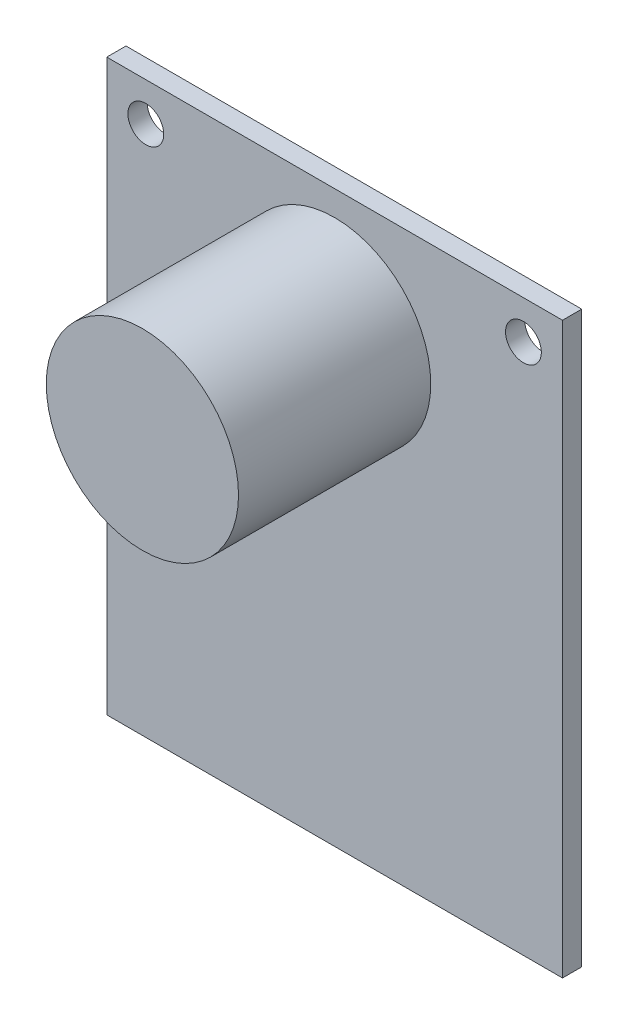
ISO-10303-21;
HEADER;
FILE_DESCRIPTION(('STEP AP214'),'2;1');
FILE_NAME('part.step','',(''),(''),'','','');
FILE_SCHEMA(('AUTOMOTIVE_DESIGN { 1 0 10303 214 1 1 1 1 }'));
ENDSEC;
DATA;
#1=APPLICATION_CONTEXT('core data for automotive mechanical design processes');
#2=APPLICATION_PROTOCOL_DEFINITION('international standard','automotive_design',2000,#1);
#3=PRODUCT_CONTEXT('',#1,'mechanical');
#4=PRODUCT('Part','Part','',(#3));
#5=PRODUCT_RELATED_PRODUCT_CATEGORY('part','',(#4));
#6=PRODUCT_DEFINITION_FORMATION('','',#4);
#7=PRODUCT_DEFINITION_CONTEXT('part definition',#1,'design');
#8=PRODUCT_DEFINITION('design','',#6,#7);
#9=PRODUCT_DEFINITION_SHAPE('','',#8);
#10=(LENGTH_UNIT() NAMED_UNIT(*) SI_UNIT(.MILLI.,.METRE.));
#11=(NAMED_UNIT(*) PLANE_ANGLE_UNIT() SI_UNIT($,.RADIAN.));
#12=(NAMED_UNIT(*) SI_UNIT($,.STERADIAN.) SOLID_ANGLE_UNIT());
#13=UNCERTAINTY_MEASURE_WITH_UNIT(LENGTH_MEASURE(1.E-05),#10,'distance_accuracy_value','');
#14=(GEOMETRIC_REPRESENTATION_CONTEXT(3) GLOBAL_UNCERTAINTY_ASSIGNED_CONTEXT((#13)) GLOBAL_UNIT_ASSIGNED_CONTEXT((#10,
#11,#12)) REPRESENTATION_CONTEXT('',''));
#15=CARTESIAN_POINT('',(0.,0.,0.));
#16=DIRECTION('',(0.,0.,1.));
#17=DIRECTION('',(1.,0.,0.));
#18=AXIS2_PLACEMENT_3D('',#15,#16,#17);
#19=CARTESIAN_POINT('',(0.,0.,1.5));
#20=DIRECTION('',(0.,0.,1.));
#21=DIRECTION('',(1.,0.,0.));
#22=AXIS2_PLACEMENT_3D('',#19,#20,#21);
#23=PLANE('',#22);
#24=CARTESIAN_POINT('',(0.,35.,1.5));
#25=DIRECTION('',(0.,0.,1.));
#26=DIRECTION('',(1.,0.,0.));
#27=AXIS2_PLACEMENT_3D('',#24,#25,#26);
#28=CIRCLE('',#27,7.5);
#29=CARTESIAN_POINT('',(7.5,35.,1.5));
#30=VERTEX_POINT('',#29);
#31=EDGE_CURVE('E128',#30,#30,#28,.T.);
#32=ORIENTED_EDGE('',*,*,#31,.F.);
#33=EDGE_LOOP('',(#32));
#34=FACE_BOUND('',#33,.T.);
#35=CARTESIAN_POINT('',(-14.732,41.45,1.5));
#36=DIRECTION('',(0.,0.,1.));
#37=DIRECTION('',(1.,0.,0.));
#38=AXIS2_PLACEMENT_3D('',#35,#36,#37);
#39=CIRCLE('',#38,1.397);
#40=CARTESIAN_POINT('',(-13.335,41.45,1.5));
#41=VERTEX_POINT('',#40);
#42=EDGE_CURVE('E104',#41,#41,#39,.T.);
#43=ORIENTED_EDGE('',*,*,#42,.F.);
#44=EDGE_LOOP('',(#43));
#45=FACE_BOUND('',#44,.T.);
#46=DIRECTION('',(0.,-1.,0.));
#47=VECTOR('',#46,1.);
#48=CARTESIAN_POINT('',(-17.78,44.45,1.5));
#49=LINE('',#48,#47);
#50=CARTESIAN_POINT('',(-17.78,44.45,1.5));
#51=VERTEX_POINT('',#50);
#52=CARTESIAN_POINT('',(-17.78,0.,1.5));
#53=VERTEX_POINT('',#52);
#54=EDGE_CURVE('E89',#51,#53,#49,.T.);
#55=ORIENTED_EDGE('',*,*,#54,.T.);
#56=DIRECTION('',(1.,0.,0.));
#57=VECTOR('',#56,1.);
#58=CARTESIAN_POINT('',(-17.78,0.,1.5));
#59=LINE('',#58,#57);
#60=CARTESIAN_POINT('',(17.78,0.,1.5));
#61=VERTEX_POINT('',#60);
#62=EDGE_CURVE('E84',#53,#61,#59,.T.);
#63=ORIENTED_EDGE('',*,*,#62,.T.);
#64=DIRECTION('',(0.,1.,0.));
#65=VECTOR('',#64,1.);
#66=CARTESIAN_POINT('',(17.78,44.45,1.5));
#67=LINE('',#66,#65);
#68=CARTESIAN_POINT('',(17.78,44.45,1.5));
#69=VERTEX_POINT('',#68);
#70=EDGE_CURVE('E87',#61,#69,#67,.T.);
#71=ORIENTED_EDGE('',*,*,#70,.T.);
#72=DIRECTION('',(-1.,0.,0.));
#73=VECTOR('',#72,1.);
#74=CARTESIAN_POINT('',(-17.78,44.45,1.5));
#75=LINE('',#74,#73);
#76=EDGE_CURVE('E54',#69,#51,#75,.T.);
#77=ORIENTED_EDGE('',*,*,#76,.T.);
#78=EDGE_LOOP('',(#55,#63,#71,#77));
#79=FACE_BOUND('',#78,.T.);
#80=CARTESIAN_POINT('',(14.732,41.45,1.5));
#81=DIRECTION('',(0.,0.,1.));
#82=DIRECTION('',(-1.,0.,0.));
#83=AXIS2_PLACEMENT_3D('',#80,#81,#82);
#84=CIRCLE('',#83,1.397);
#85=CARTESIAN_POINT('',(13.335,41.45,1.5));
#86=VERTEX_POINT('',#85);
#87=EDGE_CURVE('E119',#86,#86,#84,.T.);
#88=ORIENTED_EDGE('',*,*,#87,.F.);
#89=EDGE_LOOP('',(#88));
#90=FACE_BOUND('',#89,.T.);
#91=ADVANCED_FACE('F37',(#34,#45,#79,#90),#23,.T.);
#92=CARTESIAN_POINT('',(0.,0.,0.));
#93=DIRECTION('',(0.,0.,1.));
#94=DIRECTION('',(1.,0.,0.));
#95=AXIS2_PLACEMENT_3D('',#92,#93,#94);
#96=PLANE('',#95);
#97=DIRECTION('',(0.,-1.,0.));
#98=VECTOR('',#97,1.);
#99=CARTESIAN_POINT('',(-17.78,44.45,0.));
#100=LINE('',#99,#98);
#101=CARTESIAN_POINT('',(-17.78,44.45,0.));
#102=VERTEX_POINT('',#101);
#103=CARTESIAN_POINT('',(-17.78,0.,0.));
#104=VERTEX_POINT('',#103);
#105=EDGE_CURVE('E101',#102,#104,#100,.T.);
#106=ORIENTED_EDGE('',*,*,#105,.F.);
#107=DIRECTION('',(-1.,0.,0.));
#108=VECTOR('',#107,1.);
#109=CARTESIAN_POINT('',(-17.78,44.45,0.));
#110=LINE('',#109,#108);
#111=CARTESIAN_POINT('',(17.78,44.45,0.));
#112=VERTEX_POINT('',#111);
#113=EDGE_CURVE('E77',#112,#102,#110,.T.);
#114=ORIENTED_EDGE('',*,*,#113,.F.);
#115=DIRECTION('',(0.,1.,0.));
#116=VECTOR('',#115,1.);
#117=CARTESIAN_POINT('',(17.78,44.45,0.));
#118=LINE('',#117,#116);
#119=CARTESIAN_POINT('',(17.78,0.,0.));
#120=VERTEX_POINT('',#119);
#121=EDGE_CURVE('E71',#120,#112,#118,.T.);
#122=ORIENTED_EDGE('',*,*,#121,.F.);
#123=DIRECTION('',(1.,0.,0.));
#124=VECTOR('',#123,1.);
#125=CARTESIAN_POINT('',(-17.78,0.,0.));
#126=LINE('',#125,#124);
#127=EDGE_CURVE('E93',#104,#120,#126,.T.);
#128=ORIENTED_EDGE('',*,*,#127,.F.);
#129=EDGE_LOOP('',(#106,#114,#122,#128));
#130=FACE_BOUND('',#129,.T.);
#131=CARTESIAN_POINT('',(-14.732,41.45,0.));
#132=DIRECTION('',(0.,0.,1.));
#133=DIRECTION('',(1.,0.,0.));
#134=AXIS2_PLACEMENT_3D('',#131,#132,#133);
#135=CIRCLE('',#134,1.397);
#136=CARTESIAN_POINT('',(-13.335,41.45,0.));
#137=VERTEX_POINT('',#136);
#138=EDGE_CURVE('E116',#137,#137,#135,.T.);
#139=ORIENTED_EDGE('',*,*,#138,.T.);
#140=EDGE_LOOP('',(#139));
#141=FACE_BOUND('',#140,.T.);
#142=CARTESIAN_POINT('',(14.732,41.45,0.));
#143=DIRECTION('',(0.,0.,1.));
#144=DIRECTION('',(-1.,0.,0.));
#145=AXIS2_PLACEMENT_3D('',#142,#143,#144);
#146=CIRCLE('',#145,1.397);
#147=CARTESIAN_POINT('',(13.335,41.45,0.));
#148=VERTEX_POINT('',#147);
#149=EDGE_CURVE('E122',#148,#148,#146,.T.);
#150=ORIENTED_EDGE('',*,*,#149,.T.);
#151=EDGE_LOOP('',(#150));
#152=FACE_BOUND('',#151,.T.);
#153=ADVANCED_FACE('F112',(#130,#141,#152),#96,.F.);
#154=CARTESIAN_POINT('',(-17.78,44.45,1.5));
#155=DIRECTION('',(1.,0.,0.));
#156=DIRECTION('',(0.,1.,0.));
#157=AXIS2_PLACEMENT_3D('',#154,#155,#156);
#158=PLANE('',#157);
#159=ORIENTED_EDGE('',*,*,#105,.T.);
#160=DIRECTION('',(0.,0.,-1.));
#161=VECTOR('',#160,1.);
#162=CARTESIAN_POINT('',(-17.78,0.,1.5));
#163=LINE('',#162,#161);
#164=EDGE_CURVE('E11',#53,#104,#163,.T.);
#165=ORIENTED_EDGE('',*,*,#164,.F.);
#166=ORIENTED_EDGE('',*,*,#54,.F.);
#167=DIRECTION('',(0.,0.,-1.));
#168=VECTOR('',#167,1.);
#169=CARTESIAN_POINT('',(-17.78,44.45,1.5));
#170=LINE('',#169,#168);
#171=EDGE_CURVE('E97',#51,#102,#170,.T.);
#172=ORIENTED_EDGE('',*,*,#171,.T.);
#173=EDGE_LOOP('',(#159,#165,#166,#172));
#174=FACE_BOUND('',#173,.T.);
#175=ADVANCED_FACE('F39',(#174),#158,.F.);
#176=CARTESIAN_POINT('',(-17.78,0.,1.5));
#177=DIRECTION('',(0.,1.,0.));
#178=DIRECTION('',(-1.,0.,0.));
#179=AXIS2_PLACEMENT_3D('',#176,#177,#178);
#180=PLANE('',#179);
#181=ORIENTED_EDGE('',*,*,#127,.T.);
#182=DIRECTION('',(0.,0.,-1.));
#183=VECTOR('',#182,1.);
#184=CARTESIAN_POINT('',(17.78,0.,1.5));
#185=LINE('',#184,#183);
#186=EDGE_CURVE('E46',#61,#120,#185,.T.);
#187=ORIENTED_EDGE('',*,*,#186,.F.);
#188=ORIENTED_EDGE('',*,*,#62,.F.);
#189=ORIENTED_EDGE('',*,*,#164,.T.);
#190=EDGE_LOOP('',(#181,#187,#188,#189));
#191=FACE_BOUND('',#190,.T.);
#192=ADVANCED_FACE('F92',(#191),#180,.F.);
#193=CARTESIAN_POINT('',(17.78,44.45,1.5));
#194=DIRECTION('',(-1.,0.,0.));
#195=DIRECTION('',(0.,-1.,0.));
#196=AXIS2_PLACEMENT_3D('',#193,#194,#195);
#197=PLANE('',#196);
#198=ORIENTED_EDGE('',*,*,#121,.T.);
#199=DIRECTION('',(0.,0.,-1.));
#200=VECTOR('',#199,1.);
#201=CARTESIAN_POINT('',(17.78,44.45,1.5));
#202=LINE('',#201,#200);
#203=EDGE_CURVE('E94',#69,#112,#202,.T.);
#204=ORIENTED_EDGE('',*,*,#203,.F.);
#205=ORIENTED_EDGE('',*,*,#70,.F.);
#206=ORIENTED_EDGE('',*,*,#186,.T.);
#207=EDGE_LOOP('',(#198,#204,#205,#206));
#208=FACE_BOUND('',#207,.T.);
#209=ADVANCED_FACE('F95',(#208),#197,.F.);
#210=CARTESIAN_POINT('',(-17.78,44.45,1.5));
#211=DIRECTION('',(0.,-1.,0.));
#212=DIRECTION('',(1.,0.,0.));
#213=AXIS2_PLACEMENT_3D('',#210,#211,#212);
#214=PLANE('',#213);
#215=ORIENTED_EDGE('',*,*,#113,.T.);
#216=ORIENTED_EDGE('',*,*,#171,.F.);
#217=ORIENTED_EDGE('',*,*,#76,.F.);
#218=ORIENTED_EDGE('',*,*,#203,.T.);
#219=EDGE_LOOP('',(#215,#216,#217,#218));
#220=FACE_BOUND('',#219,.T.);
#221=ADVANCED_FACE('F109',(#220),#214,.F.);
#222=CARTESIAN_POINT('',(-14.732,41.45,1.5));
#223=DIRECTION('',(0.,0.,-1.));
#224=DIRECTION('',(-1.,0.,0.));
#225=AXIS2_PLACEMENT_3D('',#222,#223,#224);
#226=CYLINDRICAL_SURFACE('',#225,1.397);
#227=ORIENTED_EDGE('',*,*,#42,.T.);
#228=EDGE_LOOP('',(#227));
#229=FACE_BOUND('',#228,.T.);
#230=ORIENTED_EDGE('',*,*,#138,.F.);
#231=EDGE_LOOP('',(#230));
#232=FACE_BOUND('',#231,.T.);
#233=ADVANCED_FACE('F148',(#229,#232),#226,.F.);
#234=CARTESIAN_POINT('',(14.732,41.45,1.5));
#235=DIRECTION('',(0.,0.,-1.));
#236=DIRECTION('',(-1.,0.,0.));
#237=AXIS2_PLACEMENT_3D('',#234,#235,#236);
#238=CYLINDRICAL_SURFACE('',#237,1.397);
#239=ORIENTED_EDGE('',*,*,#87,.T.);
#240=EDGE_LOOP('',(#239));
#241=FACE_BOUND('',#240,.T.);
#242=ORIENTED_EDGE('',*,*,#149,.F.);
#243=EDGE_LOOP('',(#242));
#244=FACE_BOUND('',#243,.T.);
#245=ADVANCED_FACE('F139',(#241,#244),#238,.F.);
#246=CARTESIAN_POINT('',(0.,35.,16.5));
#247=DIRECTION('',(0.,0.,-1.));
#248=DIRECTION('',(-1.,0.,0.));
#249=AXIS2_PLACEMENT_3D('',#246,#247,#248);
#250=CYLINDRICAL_SURFACE('',#249,7.5);
#251=CARTESIAN_POINT('',(0.,35.,16.5));
#252=DIRECTION('',(0.,0.,1.));
#253=DIRECTION('',(1.,0.,0.));
#254=AXIS2_PLACEMENT_3D('',#251,#252,#253);
#255=CIRCLE('',#254,7.5);
#256=CARTESIAN_POINT('',(7.5,35.,16.5));
#257=VERTEX_POINT('',#256);
#258=EDGE_CURVE('E125',#257,#257,#255,.T.);
#259=ORIENTED_EDGE('',*,*,#258,.F.);
#260=EDGE_LOOP('',(#259));
#261=FACE_BOUND('',#260,.T.);
#262=ORIENTED_EDGE('',*,*,#31,.T.);
#263=EDGE_LOOP('',(#262));
#264=FACE_BOUND('',#263,.T.);
#265=ADVANCED_FACE('F136',(#261,#264),#250,.T.);
#266=CARTESIAN_POINT('',(0.,35.,16.5));
#267=DIRECTION('',(0.,0.,1.));
#268=DIRECTION('',(1.,0.,0.));
#269=AXIS2_PLACEMENT_3D('',#266,#267,#268);
#270=PLANE('',#269);
#271=ORIENTED_EDGE('',*,*,#258,.T.);
#272=EDGE_LOOP('',(#271));
#273=FACE_BOUND('',#272,.T.);
#274=ADVANCED_FACE('F134',(#273),#270,.T.);
#275=CLOSED_SHELL('',(#91,#153,#175,#192,#209,#221,#233,#245,#265,#274));
#276=MANIFOLD_SOLID_BREP('B2',#275);
#277=ADVANCED_BREP_SHAPE_REPRESENTATION('',(#18,#276),#14);
#278=SHAPE_DEFINITION_REPRESENTATION(#9,#277);
ENDSEC;
END-ISO-10303-21;
